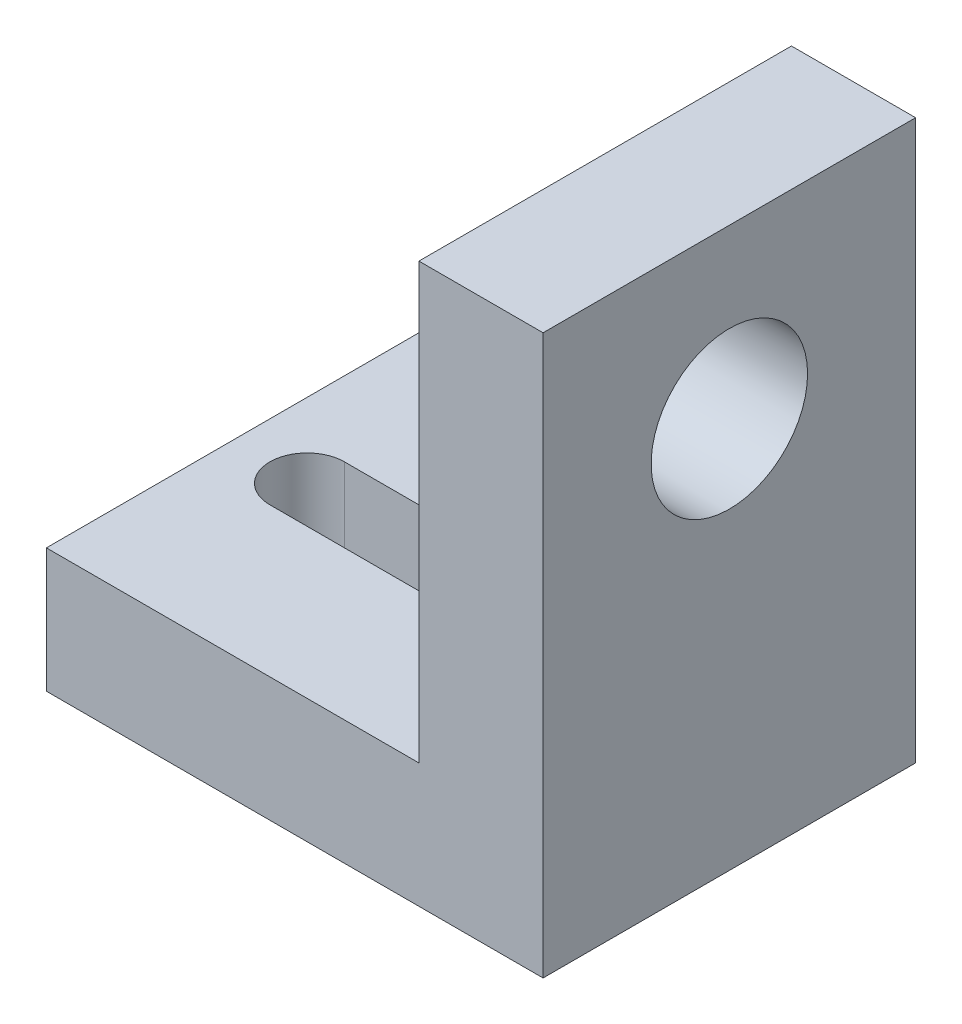
ISO-10303-21;
HEADER;
FILE_DESCRIPTION(('STEP AP214'),'2;1');
FILE_NAME('part.step','',(''),(''),'','','');
FILE_SCHEMA(('AUTOMOTIVE_DESIGN { 1 0 10303 214 1 1 1 1 }'));
ENDSEC;
DATA;
#1=APPLICATION_CONTEXT('core data for automotive mechanical design processes');
#2=APPLICATION_PROTOCOL_DEFINITION('international standard','automotive_design',2000,#1);
#3=PRODUCT_CONTEXT('',#1,'mechanical');
#4=PRODUCT('Part','Part','',(#3));
#5=PRODUCT_RELATED_PRODUCT_CATEGORY('part','',(#4));
#6=PRODUCT_DEFINITION_FORMATION('','',#4);
#7=PRODUCT_DEFINITION_CONTEXT('part definition',#1,'design');
#8=PRODUCT_DEFINITION('design','',#6,#7);
#9=PRODUCT_DEFINITION_SHAPE('','',#8);
#10=(LENGTH_UNIT() NAMED_UNIT(*) SI_UNIT(.MILLI.,.METRE.));
#11=(NAMED_UNIT(*) PLANE_ANGLE_UNIT() SI_UNIT($,.RADIAN.));
#12=(NAMED_UNIT(*) SI_UNIT($,.STERADIAN.) SOLID_ANGLE_UNIT());
#13=UNCERTAINTY_MEASURE_WITH_UNIT(LENGTH_MEASURE(1.E-05),#10,'distance_accuracy_value','');
#14=(GEOMETRIC_REPRESENTATION_CONTEXT(3) GLOBAL_UNCERTAINTY_ASSIGNED_CONTEXT((#13)) GLOBAL_UNIT_ASSIGNED_CONTEXT((#10,
#11,#12)) REPRESENTATION_CONTEXT('',''));
#15=CARTESIAN_POINT('',(0.,0.,0.));
#16=DIRECTION('',(0.,0.,1.));
#17=DIRECTION('',(1.,0.,0.));
#18=AXIS2_PLACEMENT_3D('',#15,#16,#17);
#19=CARTESIAN_POINT('',(-10.,15.75,0.));
#20=DIRECTION('',(1.,0.,0.));
#21=DIRECTION('',(0.,0.,-1.));
#22=AXIS2_PLACEMENT_3D('',#19,#20,#21);
#23=CYLINDRICAL_SURFACE('',#22,3.15);
#24=CARTESIAN_POINT('',(10.,15.75,0.));
#25=DIRECTION('',(1.,0.,0.));
#26=DIRECTION('',(0.,0.,-1.));
#27=AXIS2_PLACEMENT_3D('',#24,#25,#26);
#28=CIRCLE('',#27,3.15);
#29=CARTESIAN_POINT('',(10.,15.75,-3.15000000000001));
#30=VERTEX_POINT('',#29);
#31=EDGE_CURVE('E217',#30,#30,#28,.T.);
#32=ORIENTED_EDGE('',*,*,#31,.T.);
#33=EDGE_LOOP('',(#32));
#34=FACE_BOUND('',#33,.T.);
#35=CARTESIAN_POINT('',(5.2,15.75,0.));
#36=DIRECTION('',(-1.,0.,0.));
#37=DIRECTION('',(0.,0.,1.));
#38=AXIS2_PLACEMENT_3D('',#35,#36,#37);
#39=CIRCLE('',#38,3.15);
#40=CARTESIAN_POINT('',(5.2,15.75,3.14999999999999));
#41=VERTEX_POINT('',#40);
#42=EDGE_CURVE('E41',#41,#41,#39,.F.);
#43=ORIENTED_EDGE('',*,*,#42,.F.);
#44=EDGE_LOOP('',(#43));
#45=FACE_BOUND('',#44,.T.);
#46=ADVANCED_FACE('F33',(#34,#45),#23,.F.);
#47=CARTESIAN_POINT('',(0.,5.,0.));
#48=DIRECTION('',(0.,-1.,0.));
#49=DIRECTION('',(0.,0.,-1.));
#50=AXIS2_PLACEMENT_3D('',#47,#48,#49);
#51=PLANE('',#50);
#52=DIRECTION('',(-1.,0.,0.));
#53=VECTOR('',#52,1.);
#54=CARTESIAN_POINT('',(-7.,5.,-1.50000000000001));
#55=LINE('',#54,#53);
#56=CARTESIAN_POINT('',(2.,5.,-1.5));
#57=VERTEX_POINT('',#56);
#58=CARTESIAN_POINT('',(-7.,5.,-1.50000000000001));
#59=VERTEX_POINT('',#58);
#60=EDGE_CURVE('E233',#57,#59,#55,.T.);
#61=ORIENTED_EDGE('',*,*,#60,.F.);
#62=CARTESIAN_POINT('',(2.,5.,0.));
#63=DIRECTION('',(0.,1.,0.));
#64=DIRECTION('',(0.,0.,1.));
#65=AXIS2_PLACEMENT_3D('',#62,#63,#64);
#66=CIRCLE('',#65,1.5);
#67=CARTESIAN_POINT('',(2.,5.,1.5));
#68=VERTEX_POINT('',#67);
#69=EDGE_CURVE('E55',#68,#57,#66,.T.);
#70=ORIENTED_EDGE('',*,*,#69,.F.);
#71=DIRECTION('',(1.,0.,0.));
#72=VECTOR('',#71,1.);
#73=CARTESIAN_POINT('',(2.,5.,1.5));
#74=LINE('',#73,#72);
#75=CARTESIAN_POINT('',(-7.,5.,1.5));
#76=VERTEX_POINT('',#75);
#77=EDGE_CURVE('E223',#76,#68,#74,.T.);
#78=ORIENTED_EDGE('',*,*,#77,.F.);
#79=CARTESIAN_POINT('',(-7.,5.,0.));
#80=DIRECTION('',(0.,1.,0.));
#81=DIRECTION('',(0.,0.,1.));
#82=AXIS2_PLACEMENT_3D('',#79,#80,#81);
#83=CIRCLE('',#82,1.5);
#84=EDGE_CURVE('E230',#59,#76,#83,.T.);
#85=ORIENTED_EDGE('',*,*,#84,.F.);
#86=EDGE_LOOP('',(#61,#70,#78,#85));
#87=FACE_BOUND('',#86,.T.);
#88=DIRECTION('',(0.,0.,1.));
#89=VECTOR('',#88,1.);
#90=CARTESIAN_POINT('',(5.,5.,7.5));
#91=LINE('',#90,#89);
#92=CARTESIAN_POINT('',(5.,5.,-7.5));
#93=VERTEX_POINT('',#92);
#94=CARTESIAN_POINT('',(5.,5.,7.5));
#95=VERTEX_POINT('',#94);
#96=EDGE_CURVE('E215',#93,#95,#91,.T.);
#97=ORIENTED_EDGE('',*,*,#96,.F.);
#98=DIRECTION('',(-1.,0.,0.));
#99=VECTOR('',#98,1.);
#100=CARTESIAN_POINT('',(-10.,5.,-7.5));
#101=LINE('',#100,#99);
#102=CARTESIAN_POINT('',(-10.,5.,-7.5));
#103=VERTEX_POINT('',#102);
#104=EDGE_CURVE('E199',#93,#103,#101,.T.);
#105=ORIENTED_EDGE('',*,*,#104,.T.);
#106=DIRECTION('',(0.,0.,1.));
#107=VECTOR('',#106,1.);
#108=CARTESIAN_POINT('',(-10.,5.,7.5));
#109=LINE('',#108,#107);
#110=CARTESIAN_POINT('',(-10.,5.,7.5));
#111=VERTEX_POINT('',#110);
#112=EDGE_CURVE('E204',#103,#111,#109,.T.);
#113=ORIENTED_EDGE('',*,*,#112,.T.);
#114=DIRECTION('',(1.,0.,0.));
#115=VECTOR('',#114,1.);
#116=CARTESIAN_POINT('',(-10.,5.,7.5));
#117=LINE('',#116,#115);
#118=EDGE_CURVE('E205',#111,#95,#117,.T.);
#119=ORIENTED_EDGE('',*,*,#118,.T.);
#120=EDGE_LOOP('',(#97,#105,#113,#119));
#121=FACE_BOUND('',#120,.T.);
#122=ADVANCED_FACE('F149',(#87,#121),#51,.F.);
#123=CARTESIAN_POINT('',(-10.,5.,7.5));
#124=DIRECTION('',(1.,0.,0.));
#125=DIRECTION('',(0.,0.,-1.));
#126=AXIS2_PLACEMENT_3D('',#123,#124,#125);
#127=PLANE('',#126);
#128=DIRECTION('',(0.,0.,1.));
#129=VECTOR('',#128,1.);
#130=CARTESIAN_POINT('',(-10.,0.,7.5));
#131=LINE('',#130,#129);
#132=CARTESIAN_POINT('',(-10.,0.,-7.5));
#133=VERTEX_POINT('',#132);
#134=CARTESIAN_POINT('',(-10.,0.,7.5));
#135=VERTEX_POINT('',#134);
#136=EDGE_CURVE('E187',#133,#135,#131,.T.);
#137=ORIENTED_EDGE('',*,*,#136,.T.);
#138=DIRECTION('',(0.,-1.,0.));
#139=VECTOR('',#138,1.);
#140=CARTESIAN_POINT('',(-10.,5.,7.5));
#141=LINE('',#140,#139);
#142=EDGE_CURVE('E128',#111,#135,#141,.T.);
#143=ORIENTED_EDGE('',*,*,#142,.F.);
#144=ORIENTED_EDGE('',*,*,#112,.F.);
#145=DIRECTION('',(0.,-1.,0.));
#146=VECTOR('',#145,1.);
#147=CARTESIAN_POINT('',(-10.,5.,-7.5));
#148=LINE('',#147,#146);
#149=EDGE_CURVE('E132',#103,#133,#148,.T.);
#150=ORIENTED_EDGE('',*,*,#149,.T.);
#151=EDGE_LOOP('',(#137,#143,#144,#150));
#152=FACE_BOUND('',#151,.T.);
#153=ADVANCED_FACE('F35',(#152),#127,.F.);
#154=CARTESIAN_POINT('',(-10.,5.,7.5));
#155=DIRECTION('',(0.,0.,-1.));
#156=DIRECTION('',(-1.,0.,0.));
#157=AXIS2_PLACEMENT_3D('',#154,#155,#156);
#158=PLANE('',#157);
#159=DIRECTION('',(0.,-1.,0.));
#160=VECTOR('',#159,1.);
#161=CARTESIAN_POINT('',(10.,5.,7.5));
#162=LINE('',#161,#160);
#163=CARTESIAN_POINT('',(10.,22.5,7.5));
#164=VERTEX_POINT('',#163);
#165=CARTESIAN_POINT('',(10.,0.,7.5));
#166=VERTEX_POINT('',#165);
#167=EDGE_CURVE('E120',#164,#166,#162,.T.);
#168=ORIENTED_EDGE('',*,*,#167,.F.);
#169=DIRECTION('',(1.,0.,0.));
#170=VECTOR('',#169,1.);
#171=CARTESIAN_POINT('',(0.,22.5,7.50000000000001));
#172=LINE('',#171,#170);
#173=CARTESIAN_POINT('',(5.,22.5,7.5));
#174=VERTEX_POINT('',#173);
#175=EDGE_CURVE('E108',#174,#164,#172,.T.);
#176=ORIENTED_EDGE('',*,*,#175,.F.);
#177=DIRECTION('',(0.,-1.,0.));
#178=VECTOR('',#177,1.);
#179=CARTESIAN_POINT('',(5.,26.5,7.5));
#180=LINE('',#179,#178);
#181=EDGE_CURVE('E196',#174,#95,#180,.T.);
#182=ORIENTED_EDGE('',*,*,#181,.T.);
#183=ORIENTED_EDGE('',*,*,#118,.F.);
#184=ORIENTED_EDGE('',*,*,#142,.T.);
#185=DIRECTION('',(1.,0.,0.));
#186=VECTOR('',#185,1.);
#187=CARTESIAN_POINT('',(-10.,0.,7.5));
#188=LINE('',#187,#186);
#189=EDGE_CURVE('E126',#135,#166,#188,.T.);
#190=ORIENTED_EDGE('',*,*,#189,.T.);
#191=EDGE_LOOP('',(#168,#176,#182,#183,#184,#190));
#192=FACE_BOUND('',#191,.T.);
#193=ADVANCED_FACE('F124',(#192),#158,.F.);
#194=CARTESIAN_POINT('',(10.,5.,7.5));
#195=DIRECTION('',(-1.,0.,0.));
#196=DIRECTION('',(0.,0.,1.));
#197=AXIS2_PLACEMENT_3D('',#194,#195,#196);
#198=PLANE('',#197);
#199=ORIENTED_EDGE('',*,*,#31,.F.);
#200=EDGE_LOOP('',(#199));
#201=FACE_BOUND('',#200,.T.);
#202=DIRECTION('',(0.,-1.,0.));
#203=VECTOR('',#202,1.);
#204=CARTESIAN_POINT('',(10.,5.,-7.5));
#205=LINE('',#204,#203);
#206=CARTESIAN_POINT('',(10.,22.5,-7.5));
#207=VERTEX_POINT('',#206);
#208=CARTESIAN_POINT('',(10.,0.,-7.5));
#209=VERTEX_POINT('',#208);
#210=EDGE_CURVE('E122',#207,#209,#205,.T.);
#211=ORIENTED_EDGE('',*,*,#210,.F.);
#212=DIRECTION('',(0.,0.,-1.));
#213=VECTOR('',#212,1.);
#214=CARTESIAN_POINT('',(10.,22.5,7.5));
#215=LINE('',#214,#213);
#216=EDGE_CURVE('E111',#164,#207,#215,.T.);
#217=ORIENTED_EDGE('',*,*,#216,.F.);
#218=ORIENTED_EDGE('',*,*,#167,.T.);
#219=DIRECTION('',(0.,0.,-1.));
#220=VECTOR('',#219,1.);
#221=CARTESIAN_POINT('',(10.,0.,7.5));
#222=LINE('',#221,#220);
#223=EDGE_CURVE('E194',#166,#209,#222,.T.);
#224=ORIENTED_EDGE('',*,*,#223,.T.);
#225=EDGE_LOOP('',(#211,#217,#218,#224));
#226=FACE_BOUND('',#225,.T.);
#227=ADVANCED_FACE('F118',(#201,#226),#198,.F.);
#228=CARTESIAN_POINT('',(-10.,5.,-7.5));
#229=DIRECTION('',(0.,0.,1.));
#230=DIRECTION('',(1.,0.,0.));
#231=AXIS2_PLACEMENT_3D('',#228,#229,#230);
#232=PLANE('',#231);
#233=DIRECTION('',(0.,-1.,0.));
#234=VECTOR('',#233,1.);
#235=CARTESIAN_POINT('',(5.,26.5,-7.5));
#236=LINE('',#235,#234);
#237=CARTESIAN_POINT('',(5.,22.5,-7.5));
#238=VERTEX_POINT('',#237);
#239=EDGE_CURVE('E192',#238,#93,#236,.T.);
#240=ORIENTED_EDGE('',*,*,#239,.F.);
#241=DIRECTION('',(1.,0.,0.));
#242=VECTOR('',#241,1.);
#243=CARTESIAN_POINT('',(0.,22.5,-7.49999999999999));
#244=LINE('',#243,#242);
#245=EDGE_CURVE('E48',#238,#207,#244,.T.);
#246=ORIENTED_EDGE('',*,*,#245,.T.);
#247=ORIENTED_EDGE('',*,*,#210,.T.);
#248=DIRECTION('',(-1.,0.,0.));
#249=VECTOR('',#248,1.);
#250=CARTESIAN_POINT('',(-10.,0.,-7.5));
#251=LINE('',#250,#249);
#252=EDGE_CURVE('E203',#209,#133,#251,.T.);
#253=ORIENTED_EDGE('',*,*,#252,.T.);
#254=ORIENTED_EDGE('',*,*,#149,.F.);
#255=ORIENTED_EDGE('',*,*,#104,.F.);
#256=EDGE_LOOP('',(#240,#246,#247,#253,#254,#255));
#257=FACE_BOUND('',#256,.T.);
#258=ADVANCED_FACE('F169',(#257),#232,.F.);
#259=CARTESIAN_POINT('',(0.,0.,0.));
#260=DIRECTION('',(0.,-1.,0.));
#261=DIRECTION('',(0.,0.,-1.));
#262=AXIS2_PLACEMENT_3D('',#259,#260,#261);
#263=PLANE('',#262);
#264=CARTESIAN_POINT('',(2.,0.,0.));
#265=DIRECTION('',(0.,-1.,0.));
#266=DIRECTION('',(0.,0.,-1.));
#267=AXIS2_PLACEMENT_3D('',#264,#265,#266);
#268=CIRCLE('',#267,1.5);
#269=CARTESIAN_POINT('',(2.,0.,-1.5));
#270=VERTEX_POINT('',#269);
#271=CARTESIAN_POINT('',(2.,0.,1.5));
#272=VERTEX_POINT('',#271);
#273=EDGE_CURVE('E142',#270,#272,#268,.T.);
#274=ORIENTED_EDGE('',*,*,#273,.F.);
#275=DIRECTION('',(1.,0.,0.));
#276=VECTOR('',#275,1.);
#277=CARTESIAN_POINT('',(0.,0.,-1.5));
#278=LINE('',#277,#276);
#279=CARTESIAN_POINT('',(-7.,0.,-1.50000000000001));
#280=VERTEX_POINT('',#279);
#281=EDGE_CURVE('E130',#280,#270,#278,.T.);
#282=ORIENTED_EDGE('',*,*,#281,.F.);
#283=CARTESIAN_POINT('',(-7.,0.,0.));
#284=DIRECTION('',(0.,-1.,0.));
#285=DIRECTION('',(0.,0.,-1.));
#286=AXIS2_PLACEMENT_3D('',#283,#284,#285);
#287=CIRCLE('',#286,1.5);
#288=CARTESIAN_POINT('',(-7.,0.,1.5));
#289=VERTEX_POINT('',#288);
#290=EDGE_CURVE('E137',#289,#280,#287,.T.);
#291=ORIENTED_EDGE('',*,*,#290,.F.);
#292=DIRECTION('',(-1.,0.,0.));
#293=VECTOR('',#292,1.);
#294=CARTESIAN_POINT('',(0.,0.,1.5));
#295=LINE('',#294,#293);
#296=EDGE_CURVE('E140',#272,#289,#295,.T.);
#297=ORIENTED_EDGE('',*,*,#296,.F.);
#298=EDGE_LOOP('',(#274,#282,#291,#297));
#299=FACE_BOUND('',#298,.T.);
#300=ORIENTED_EDGE('',*,*,#136,.F.);
#301=ORIENTED_EDGE('',*,*,#252,.F.);
#302=ORIENTED_EDGE('',*,*,#223,.F.);
#303=ORIENTED_EDGE('',*,*,#189,.F.);
#304=EDGE_LOOP('',(#300,#301,#302,#303));
#305=FACE_BOUND('',#304,.T.);
#306=ADVANCED_FACE('F164',(#299,#305),#263,.T.);
#307=CARTESIAN_POINT('',(5.,26.5,7.5));
#308=DIRECTION('',(1.,0.,0.));
#309=DIRECTION('',(0.,0.,-1.));
#310=AXIS2_PLACEMENT_3D('',#307,#308,#309);
#311=PLANE('',#310);
#312=ORIENTED_EDGE('',*,*,#181,.F.);
#313=DIRECTION('',(0.,0.,-1.));
#314=VECTOR('',#313,1.);
#315=CARTESIAN_POINT('',(5.,22.5,7.5));
#316=LINE('',#315,#314);
#317=EDGE_CURVE('E11',#174,#238,#316,.T.);
#318=ORIENTED_EDGE('',*,*,#317,.T.);
#319=ORIENTED_EDGE('',*,*,#239,.T.);
#320=ORIENTED_EDGE('',*,*,#96,.T.);
#321=EDGE_LOOP('',(#312,#318,#319,#320));
#322=FACE_BOUND('',#321,.T.);
#323=ADVANCED_FACE('F162',(#322),#311,.F.);
#324=CARTESIAN_POINT('',(2.,-15.,0.));
#325=DIRECTION('',(0.,1.,0.));
#326=DIRECTION('',(0.,0.,1.));
#327=AXIS2_PLACEMENT_3D('',#324,#325,#326);
#328=CYLINDRICAL_SURFACE('',#327,1.5);
#329=ORIENTED_EDGE('',*,*,#273,.T.);
#330=DIRECTION('',(0.,1.,0.));
#331=VECTOR('',#330,1.);
#332=CARTESIAN_POINT('',(2.,-15.,1.5));
#333=LINE('',#332,#331);
#334=EDGE_CURVE('E219',#272,#68,#333,.T.);
#335=ORIENTED_EDGE('',*,*,#334,.T.);
#336=ORIENTED_EDGE('',*,*,#69,.T.);
#337=DIRECTION('',(0.,1.,0.));
#338=VECTOR('',#337,1.);
#339=CARTESIAN_POINT('',(2.,-15.,-1.5));
#340=LINE('',#339,#338);
#341=EDGE_CURVE('E220',#270,#57,#340,.T.);
#342=ORIENTED_EDGE('',*,*,#341,.F.);
#343=EDGE_LOOP('',(#329,#335,#336,#342));
#344=FACE_BOUND('',#343,.T.);
#345=ADVANCED_FACE('F160',(#344),#328,.F.);
#346=CARTESIAN_POINT('',(2.,-15.,1.5));
#347=DIRECTION('',(0.,0.,1.));
#348=DIRECTION('',(1.,0.,0.));
#349=AXIS2_PLACEMENT_3D('',#346,#347,#348);
#350=PLANE('',#349);
#351=ORIENTED_EDGE('',*,*,#296,.T.);
#352=DIRECTION('',(0.,1.,0.));
#353=VECTOR('',#352,1.);
#354=CARTESIAN_POINT('',(-7.,-15.,1.5));
#355=LINE('',#354,#353);
#356=EDGE_CURVE('E225',#289,#76,#355,.T.);
#357=ORIENTED_EDGE('',*,*,#356,.T.);
#358=ORIENTED_EDGE('',*,*,#77,.T.);
#359=ORIENTED_EDGE('',*,*,#334,.F.);
#360=EDGE_LOOP('',(#351,#357,#358,#359));
#361=FACE_BOUND('',#360,.T.);
#362=ADVANCED_FACE('F252',(#361),#350,.F.);
#363=CARTESIAN_POINT('',(-7.,-15.,0.));
#364=DIRECTION('',(0.,1.,0.));
#365=DIRECTION('',(0.,0.,1.));
#366=AXIS2_PLACEMENT_3D('',#363,#364,#365);
#367=CYLINDRICAL_SURFACE('',#366,1.5);
#368=ORIENTED_EDGE('',*,*,#290,.T.);
#369=DIRECTION('',(0.,1.,0.));
#370=VECTOR('',#369,1.);
#371=CARTESIAN_POINT('',(-7.,-15.,-1.50000000000001));
#372=LINE('',#371,#370);
#373=EDGE_CURVE('E222',#280,#59,#372,.T.);
#374=ORIENTED_EDGE('',*,*,#373,.T.);
#375=ORIENTED_EDGE('',*,*,#84,.T.);
#376=ORIENTED_EDGE('',*,*,#356,.F.);
#377=EDGE_LOOP('',(#368,#374,#375,#376));
#378=FACE_BOUND('',#377,.T.);
#379=ADVANCED_FACE('F245',(#378),#367,.F.);
#380=CARTESIAN_POINT('',(-7.,-15.,-1.50000000000001));
#381=DIRECTION('',(0.,0.,-1.));
#382=DIRECTION('',(-1.,0.,0.));
#383=AXIS2_PLACEMENT_3D('',#380,#381,#382);
#384=PLANE('',#383);
#385=ORIENTED_EDGE('',*,*,#281,.T.);
#386=ORIENTED_EDGE('',*,*,#341,.T.);
#387=ORIENTED_EDGE('',*,*,#60,.T.);
#388=ORIENTED_EDGE('',*,*,#373,.F.);
#389=EDGE_LOOP('',(#385,#386,#387,#388));
#390=FACE_BOUND('',#389,.T.);
#391=ADVANCED_FACE('F241',(#390),#384,.F.);
#392=CARTESIAN_POINT('',(5.2,15.75,0.));
#393=DIRECTION('',(-1.,0.,0.));
#394=DIRECTION('',(0.,0.,1.));
#395=AXIS2_PLACEMENT_3D('',#392,#393,#394);
#396=PLANE('',#395);
#397=ORIENTED_EDGE('',*,*,#42,.T.);
#398=EDGE_LOOP('',(#397));
#399=FACE_BOUND('',#398,.T.);
#400=ADVANCED_FACE('F146',(#399),#396,.F.);
#401=CARTESIAN_POINT('',(0.,22.5,7.50000000000001));
#402=DIRECTION('',(0.,-1.,0.));
#403=DIRECTION('',(0.,0.,-1.));
#404=AXIS2_PLACEMENT_3D('',#401,#402,#403);
#405=PLANE('',#404);
#406=ORIENTED_EDGE('',*,*,#175,.T.);
#407=ORIENTED_EDGE('',*,*,#216,.T.);
#408=ORIENTED_EDGE('',*,*,#245,.F.);
#409=ORIENTED_EDGE('',*,*,#317,.F.);
#410=EDGE_LOOP('',(#406,#407,#408,#409));
#411=FACE_BOUND('',#410,.T.);
#412=ADVANCED_FACE('F110',(#411),#405,.F.);
#413=CLOSED_SHELL('',(#46,#122,#153,#193,#227,#258,#306,#323,#345,#362,#379,#391,#400,#412));
#414=MANIFOLD_SOLID_BREP('B2',#413);
#415=ADVANCED_BREP_SHAPE_REPRESENTATION('',(#18,#414),#14);
#416=SHAPE_DEFINITION_REPRESENTATION(#9,#415);
ENDSEC;
END-ISO-10303-21;
